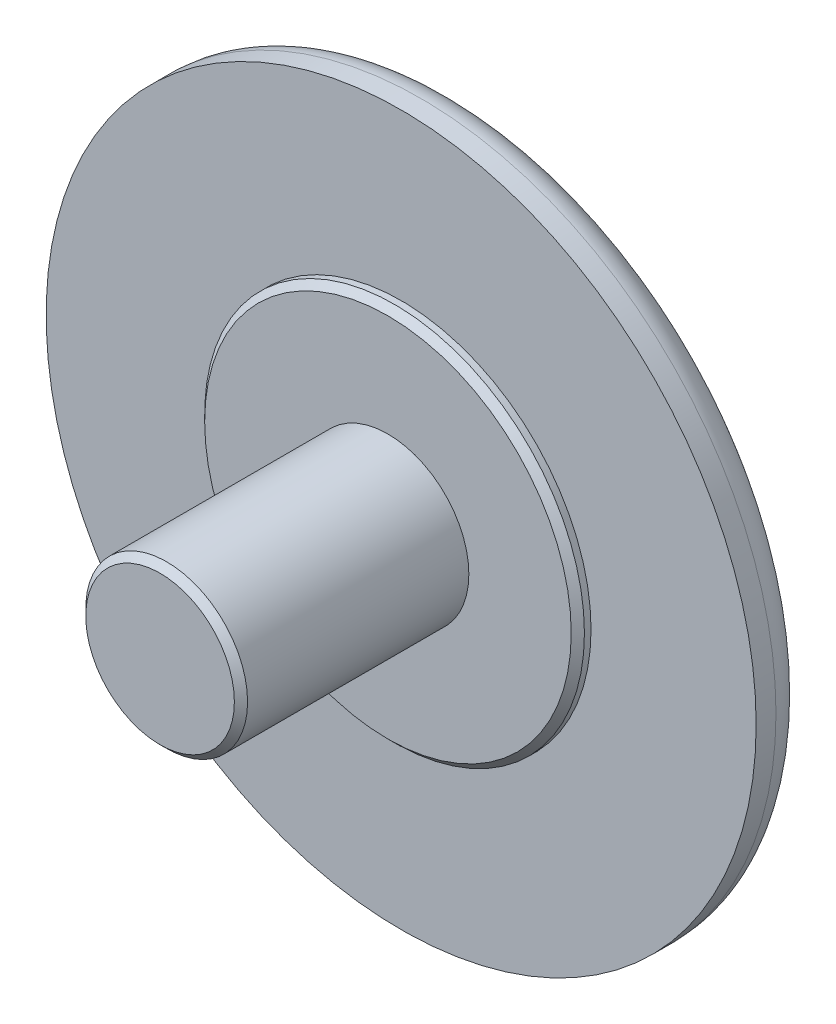
ISO-10303-21;
HEADER;
FILE_DESCRIPTION(('STEP AP214'),'2;1');
FILE_NAME('part.step','',(''),(''),'','','');
FILE_SCHEMA(('AUTOMOTIVE_DESIGN { 1 0 10303 214 1 1 1 1 }'));
ENDSEC;
DATA;
#1=APPLICATION_CONTEXT('core data for automotive mechanical design processes');
#2=APPLICATION_PROTOCOL_DEFINITION('international standard','automotive_design',2000,#1);
#3=PRODUCT_CONTEXT('',#1,'mechanical');
#4=PRODUCT('Part','Part','',(#3));
#5=PRODUCT_RELATED_PRODUCT_CATEGORY('part','',(#4));
#6=PRODUCT_DEFINITION_FORMATION('','',#4);
#7=PRODUCT_DEFINITION_CONTEXT('part definition',#1,'design');
#8=PRODUCT_DEFINITION('design','',#6,#7);
#9=PRODUCT_DEFINITION_SHAPE('','',#8);
#10=(LENGTH_UNIT() NAMED_UNIT(*) SI_UNIT(.MILLI.,.METRE.));
#11=(NAMED_UNIT(*) PLANE_ANGLE_UNIT() SI_UNIT($,.RADIAN.));
#12=(NAMED_UNIT(*) SI_UNIT($,.STERADIAN.) SOLID_ANGLE_UNIT());
#13=UNCERTAINTY_MEASURE_WITH_UNIT(LENGTH_MEASURE(1.E-05),#10,'distance_accuracy_value','');
#14=(GEOMETRIC_REPRESENTATION_CONTEXT(3) GLOBAL_UNCERTAINTY_ASSIGNED_CONTEXT((#13)) GLOBAL_UNIT_ASSIGNED_CONTEXT((#10,
#11,#12)) REPRESENTATION_CONTEXT('',''));
#15=CARTESIAN_POINT('',(0.,0.,0.));
#16=DIRECTION('',(0.,0.,1.));
#17=DIRECTION('',(1.,0.,0.));
#18=AXIS2_PLACEMENT_3D('',#15,#16,#17);
#19=CARTESIAN_POINT('',(0.,0.,0.));
#20=DIRECTION('',(0.,0.,1.));
#21=DIRECTION('',(1.,0.,0.));
#22=AXIS2_PLACEMENT_3D('',#19,#20,#21);
#23=CYLINDRICAL_SURFACE('',#22,2.45);
#24=CARTESIAN_POINT('',(0.,0.,-0.199999999999997));
#25=DIRECTION('',(0.,0.,1.));
#26=DIRECTION('',(1.,0.,0.));
#27=AXIS2_PLACEMENT_3D('',#24,#25,#26);
#28=CIRCLE('',#27,2.45);
#29=CARTESIAN_POINT('',(2.45,0.,-0.199999999999997));
#30=VERTEX_POINT('',#29);
#31=EDGE_CURVE('E10',#30,#30,#28,.F.);
#32=ORIENTED_EDGE('',*,*,#31,.T.);
#33=EDGE_LOOP('',(#32));
#34=FACE_BOUND('',#33,.T.);
#35=CARTESIAN_POINT('',(0.,0.,-6.9));
#36=DIRECTION('',(0.,0.,1.));
#37=DIRECTION('',(1.,0.,0.));
#38=AXIS2_PLACEMENT_3D('',#35,#36,#37);
#39=CIRCLE('',#38,2.45);
#40=CARTESIAN_POINT('',(2.45,0.,-6.9));
#41=VERTEX_POINT('',#40);
#42=EDGE_CURVE('E77',#41,#41,#39,.T.);
#43=ORIENTED_EDGE('',*,*,#42,.T.);
#44=EDGE_LOOP('',(#43));
#45=FACE_BOUND('',#44,.T.);
#46=ADVANCED_FACE('F37',(#34,#45),#23,.T.);
#47=CARTESIAN_POINT('',(2.45,0.,0.));
#48=DIRECTION('',(0.,0.,1.));
#49=DIRECTION('',(1.,0.,0.));
#50=AXIS2_PLACEMENT_3D('',#47,#48,#49);
#51=PLANE('',#50);
#52=CARTESIAN_POINT('',(0.,0.,0.));
#53=DIRECTION('',(0.,0.,1.));
#54=DIRECTION('',(1.,0.,0.));
#55=AXIS2_PLACEMENT_3D('',#52,#53,#54);
#56=CIRCLE('',#55,2.25000000000001);
#57=CARTESIAN_POINT('',(2.25000000000001,0.,0.));
#58=VERTEX_POINT('',#57);
#59=EDGE_CURVE('E45',#58,#58,#56,.T.);
#60=ORIENTED_EDGE('',*,*,#59,.T.);
#61=EDGE_LOOP('',(#60));
#62=FACE_BOUND('',#61,.T.);
#63=ADVANCED_FACE('F98',(#62),#51,.T.);
#64=CARTESIAN_POINT('',(0.,0.,-8.9));
#65=DIRECTION('',(0.,0.,-1.));
#66=DIRECTION('',(-1.,0.,0.));
#67=AXIS2_PLACEMENT_3D('',#64,#65,#66);
#68=PLANE('',#67);
#69=CARTESIAN_POINT('',(0.,0.,-8.9));
#70=DIRECTION('',(0.,0.,1.));
#71=DIRECTION('',(1.,0.,0.));
#72=AXIS2_PLACEMENT_3D('',#69,#70,#71);
#73=CIRCLE('',#72,9.74999999999999);
#74=CARTESIAN_POINT('',(9.74999999999999,0.,-8.9));
#75=VERTEX_POINT('',#74);
#76=EDGE_CURVE('E61',#75,#75,#73,.T.);
#77=ORIENTED_EDGE('',*,*,#76,.F.);
#78=EDGE_LOOP('',(#77));
#79=FACE_BOUND('',#78,.T.);
#80=ADVANCED_FACE('F103',(#79),#68,.T.);
#81=CARTESIAN_POINT('',(0.,0.,-7.9));
#82=DIRECTION('',(0.,0.,1.));
#83=DIRECTION('',(1.,0.,0.));
#84=AXIS2_PLACEMENT_3D('',#81,#82,#83);
#85=TOROIDAL_SURFACE('',#84,9.75,1.);
#86=ORIENTED_EDGE('',*,*,#76,.T.);
#87=EDGE_LOOP('',(#86));
#88=FACE_BOUND('',#87,.T.);
#89=CARTESIAN_POINT('',(0.,0.,-7.89999999999999));
#90=DIRECTION('',(0.,0.,1.));
#91=DIRECTION('',(1.,0.,0.));
#92=AXIS2_PLACEMENT_3D('',#89,#90,#91);
#93=CIRCLE('',#92,10.75);
#94=CARTESIAN_POINT('',(10.75,0.,-7.89999999999999));
#95=VERTEX_POINT('',#94);
#96=EDGE_CURVE('E65',#95,#95,#93,.T.);
#97=ORIENTED_EDGE('',*,*,#96,.F.);
#98=EDGE_LOOP('',(#97));
#99=FACE_BOUND('',#98,.T.);
#100=ADVANCED_FACE('F108',(#88,#99),#85,.T.);
#101=CARTESIAN_POINT('',(0.,0.,0.));
#102=DIRECTION('',(0.,0.,1.));
#103=DIRECTION('',(1.,0.,0.));
#104=AXIS2_PLACEMENT_3D('',#101,#102,#103);
#105=CYLINDRICAL_SURFACE('',#104,10.75);
#106=ORIENTED_EDGE('',*,*,#96,.T.);
#107=EDGE_LOOP('',(#106));
#108=FACE_BOUND('',#107,.T.);
#109=CARTESIAN_POINT('',(0.,0.,-7.3));
#110=DIRECTION('',(0.,0.,1.));
#111=DIRECTION('',(1.,0.,0.));
#112=AXIS2_PLACEMENT_3D('',#109,#110,#111);
#113=CIRCLE('',#112,10.75);
#114=CARTESIAN_POINT('',(10.75,0.,-7.3));
#115=VERTEX_POINT('',#114);
#116=EDGE_CURVE('E69',#115,#115,#113,.T.);
#117=ORIENTED_EDGE('',*,*,#116,.F.);
#118=EDGE_LOOP('',(#117));
#119=FACE_BOUND('',#118,.T.);
#120=ADVANCED_FACE('F112',(#108,#119),#105,.T.);
#121=CARTESIAN_POINT('',(10.75,0.,-7.3));
#122=DIRECTION('',(0.,0.,1.));
#123=DIRECTION('',(1.,0.,0.));
#124=AXIS2_PLACEMENT_3D('',#121,#122,#123);
#125=PLANE('',#124);
#126=ORIENTED_EDGE('',*,*,#116,.T.);
#127=EDGE_LOOP('',(#126));
#128=FACE_BOUND('',#127,.T.);
#129=CARTESIAN_POINT('',(0.,0.,-7.3));
#130=DIRECTION('',(0.,0.,1.));
#131=DIRECTION('',(1.,0.,0.));
#132=AXIS2_PLACEMENT_3D('',#129,#130,#131);
#133=CIRCLE('',#132,5.75);
#134=CARTESIAN_POINT('',(5.75,0.,-7.3));
#135=VERTEX_POINT('',#134);
#136=EDGE_CURVE('E73',#135,#135,#133,.T.);
#137=ORIENTED_EDGE('',*,*,#136,.F.);
#138=EDGE_LOOP('',(#137));
#139=FACE_BOUND('',#138,.T.);
#140=ADVANCED_FACE('F94',(#128,#139),#125,.T.);
#141=CARTESIAN_POINT('',(0.,0.,0.));
#142=DIRECTION('',(0.,0.,1.));
#143=DIRECTION('',(1.,0.,0.));
#144=AXIS2_PLACEMENT_3D('',#141,#142,#143);
#145=CYLINDRICAL_SURFACE('',#144,5.75);
#146=CARTESIAN_POINT('',(0.,0.,-7.1));
#147=DIRECTION('',(0.,0.,1.));
#148=DIRECTION('',(1.,0.,0.));
#149=AXIS2_PLACEMENT_3D('',#146,#147,#148);
#150=CIRCLE('',#149,5.75);
#151=CARTESIAN_POINT('',(5.75,0.,-7.1));
#152=VERTEX_POINT('',#151);
#153=EDGE_CURVE('E50',#152,#152,#150,.F.);
#154=ORIENTED_EDGE('',*,*,#153,.T.);
#155=EDGE_LOOP('',(#154));
#156=FACE_BOUND('',#155,.T.);
#157=ORIENTED_EDGE('',*,*,#136,.T.);
#158=EDGE_LOOP('',(#157));
#159=FACE_BOUND('',#158,.T.);
#160=ADVANCED_FACE('F86',(#156,#159),#145,.T.);
#161=CARTESIAN_POINT('',(5.75,0.,-6.9));
#162=DIRECTION('',(0.,0.,1.));
#163=DIRECTION('',(1.,0.,0.));
#164=AXIS2_PLACEMENT_3D('',#161,#162,#163);
#165=PLANE('',#164);
#166=CARTESIAN_POINT('',(0.,0.,-6.9));
#167=DIRECTION('',(0.,0.,1.));
#168=DIRECTION('',(1.,0.,0.));
#169=AXIS2_PLACEMENT_3D('',#166,#167,#168);
#170=CIRCLE('',#169,5.55);
#171=CARTESIAN_POINT('',(5.55,0.,-6.9));
#172=VERTEX_POINT('',#171);
#173=EDGE_CURVE('E55',#172,#172,#170,.T.);
#174=ORIENTED_EDGE('',*,*,#173,.T.);
#175=EDGE_LOOP('',(#174));
#176=FACE_BOUND('',#175,.T.);
#177=ORIENTED_EDGE('',*,*,#42,.F.);
#178=EDGE_LOOP('',(#177));
#179=FACE_BOUND('',#178,.T.);
#180=ADVANCED_FACE('F83',(#176,#179),#165,.T.);
#181=CARTESIAN_POINT('',(0.,0.,-6.9));
#182=DIRECTION('',(0.,0.,-1.));
#183=DIRECTION('',(-1.,0.,0.));
#184=AXIS2_PLACEMENT_3D('',#181,#182,#183);
#185=CONICAL_SURFACE('',#184,5.55,0.78539816339744);
#186=ORIENTED_EDGE('',*,*,#153,.F.);
#187=EDGE_LOOP('',(#186));
#188=FACE_BOUND('',#187,.T.);
#189=ORIENTED_EDGE('',*,*,#173,.F.);
#190=EDGE_LOOP('',(#189));
#191=FACE_BOUND('',#190,.T.);
#192=ADVANCED_FACE('F85',(#188,#191),#185,.T.);
#193=CARTESIAN_POINT('',(0.,0.,0.));
#194=DIRECTION('',(0.,0.,-1.));
#195=DIRECTION('',(-1.,0.,0.));
#196=AXIS2_PLACEMENT_3D('',#193,#194,#195);
#197=CONICAL_SURFACE('',#196,2.25000000000001,0.785398163397442);
#198=ORIENTED_EDGE('',*,*,#31,.F.);
#199=EDGE_LOOP('',(#198));
#200=FACE_BOUND('',#199,.T.);
#201=ORIENTED_EDGE('',*,*,#59,.F.);
#202=EDGE_LOOP('',(#201));
#203=FACE_BOUND('',#202,.T.);
#204=ADVANCED_FACE('F39',(#200,#203),#197,.T.);
#205=CLOSED_SHELL('',(#46,#63,#80,#100,#120,#140,#160,#180,#192,#204));
#206=MANIFOLD_SOLID_BREP('B2',#205);
#207=ADVANCED_BREP_SHAPE_REPRESENTATION('',(#18,#206),#14);
#208=SHAPE_DEFINITION_REPRESENTATION(#9,#207);
ENDSEC;
END-ISO-10303-21;
